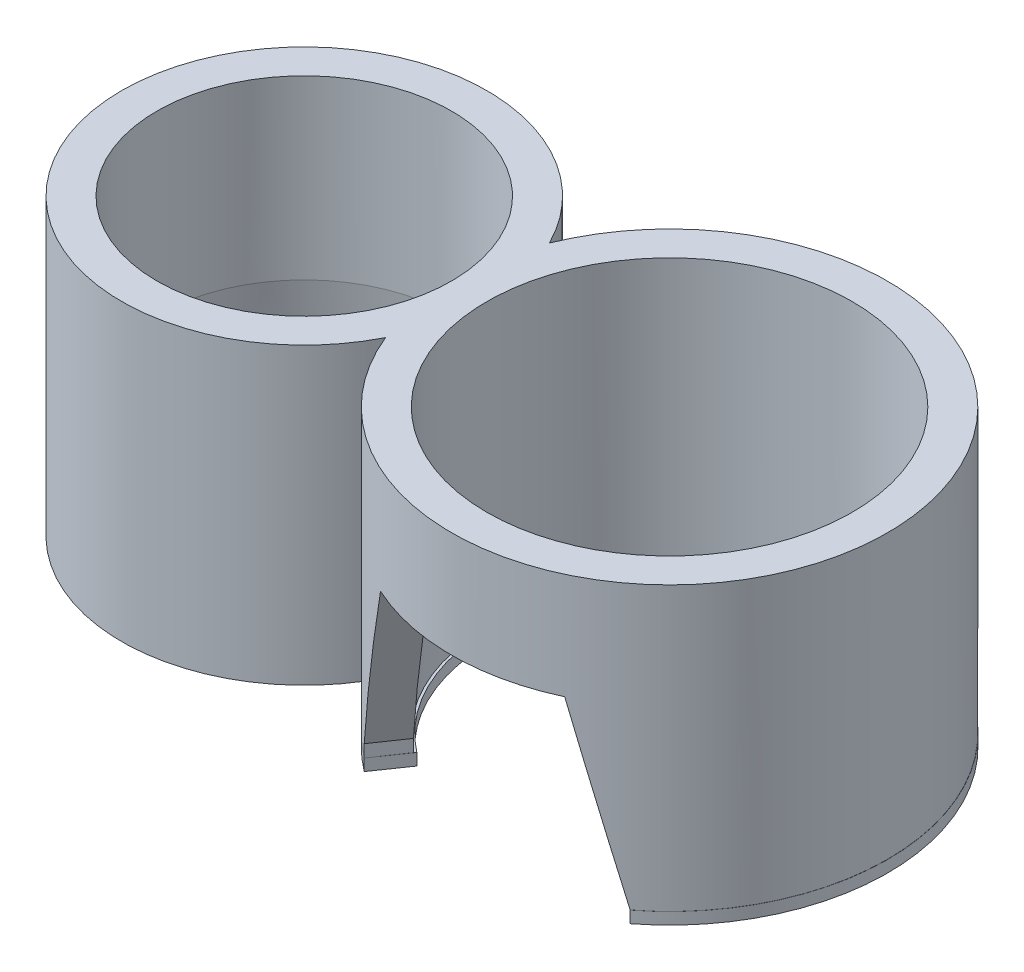
ISO-10303-21;
HEADER;
FILE_DESCRIPTION(('STEP AP214'),'2;1');
FILE_NAME('part.step','',(''),(''),'','','');
FILE_SCHEMA(('AUTOMOTIVE_DESIGN { 1 0 10303 214 1 1 1 1 }'));
ENDSEC;
DATA;
#1=APPLICATION_CONTEXT('core data for automotive mechanical design processes');
#2=APPLICATION_PROTOCOL_DEFINITION('international standard','automotive_design',2000,#1);
#3=PRODUCT_CONTEXT('',#1,'mechanical');
#4=PRODUCT('Part','Part','',(#3));
#5=PRODUCT_RELATED_PRODUCT_CATEGORY('part','',(#4));
#6=PRODUCT_DEFINITION_FORMATION('','',#4);
#7=PRODUCT_DEFINITION_CONTEXT('part definition',#1,'design');
#8=PRODUCT_DEFINITION('design','',#6,#7);
#9=PRODUCT_DEFINITION_SHAPE('','',#8);
#10=(LENGTH_UNIT() NAMED_UNIT(*) SI_UNIT(.MILLI.,.METRE.));
#11=(NAMED_UNIT(*) PLANE_ANGLE_UNIT() SI_UNIT($,.RADIAN.));
#12=(NAMED_UNIT(*) SI_UNIT($,.STERADIAN.) SOLID_ANGLE_UNIT());
#13=UNCERTAINTY_MEASURE_WITH_UNIT(LENGTH_MEASURE(1.E-05),#10,'distance_accuracy_value','');
#14=(GEOMETRIC_REPRESENTATION_CONTEXT(3) GLOBAL_UNCERTAINTY_ASSIGNED_CONTEXT((#13)) GLOBAL_UNIT_ASSIGNED_CONTEXT((#10,
#11,#12)) REPRESENTATION_CONTEXT('',''));
#15=CARTESIAN_POINT('',(0.,0.,0.));
#16=DIRECTION('',(0.,0.,1.));
#17=DIRECTION('',(1.,0.,0.));
#18=AXIS2_PLACEMENT_3D('',#15,#16,#17);
#19=CARTESIAN_POINT('',(31.,0.,0.));
#20=DIRECTION('',(0.,1.,0.));
#21=DIRECTION('',(0.,0.,1.));
#22=AXIS2_PLACEMENT_3D('',#19,#20,#21);
#23=PLANE('',#22);
#24=CARTESIAN_POINT('',(31.,0.,0.));
#25=DIRECTION('',(0.,1.,0.));
#26=DIRECTION('',(0.,0.,1.));
#27=AXIS2_PLACEMENT_3D('',#24,#25,#26);
#28=CIRCLE('',#27,18.5);
#29=CARTESIAN_POINT('',(19.8461192928033,0.,-14.759435801196));
#30=VERTEX_POINT('',#29);
#31=CARTESIAN_POINT('',(13.8548387096774,0.,-6.94934848232726));
#32=VERTEX_POINT('',#31);
#33=EDGE_CURVE('E267',#30,#32,#28,.T.);
#34=ORIENTED_EDGE('',*,*,#33,.F.);
#35=CARTESIAN_POINT('',(31.0079084105269,0.,0.));
#36=DIRECTION('',(0.,1.,0.));
#37=DIRECTION('',(0.,0.,-1.));
#38=AXIS2_PLACEMENT_3D('',#35,#36,#37);
#39=CIRCLE('',#38,18.5047691549546);
#40=CARTESIAN_POINT('',(13.856366755549,0.,-6.94630119817132));
#41=VERTEX_POINT('',#40);
#42=EDGE_CURVE('E216',#30,#41,#39,.T.);
#43=ORIENTED_EDGE('',*,*,#42,.T.);
#44=CARTESIAN_POINT('',(0.,0.,0.));
#45=DIRECTION('',(0.,1.,0.));
#46=DIRECTION('',(0.,0.,1.));
#47=AXIS2_PLACEMENT_3D('',#44,#45,#46);
#48=CIRCLE('',#47,15.5);
#49=EDGE_CURVE('E291',#32,#41,#48,.F.);
#50=ORIENTED_EDGE('',*,*,#49,.F.);
#51=EDGE_LOOP('',(#34,#43,#50));
#52=FACE_BOUND('',#51,.T.);
#53=ADVANCED_FACE('F37',(#52),#23,.F.);
#54=CARTESIAN_POINT('',(13.856366755549,0.,6.94630119817132));
#55=VERTEX_POINT('',#54);
#56=CARTESIAN_POINT('',(13.8548387096774,0.,6.94934848232726));
#57=VERTEX_POINT('',#56);
#58=EDGE_CURVE('E288',#55,#57,#48,.F.);
#59=ORIENTED_EDGE('',*,*,#58,.F.);
#60=CARTESIAN_POINT('',(19.8461192928095,0.,14.7594358012007));
#61=VERTEX_POINT('',#60);
#62=EDGE_CURVE('E212',#55,#61,#39,.T.);
#63=ORIENTED_EDGE('',*,*,#62,.T.);
#64=EDGE_CURVE('E277',#57,#61,#28,.T.);
#65=ORIENTED_EDGE('',*,*,#64,.F.);
#66=EDGE_LOOP('',(#59,#63,#65));
#67=FACE_BOUND('',#66,.T.);
#68=ADVANCED_FACE('F387',(#67),#23,.F.);
#69=CARTESIAN_POINT('',(31.,24.,0.));
#70=DIRECTION('',(0.,-1.,0.));
#71=DIRECTION('',(0.,0.,-1.));
#72=AXIS2_PLACEMENT_3D('',#69,#70,#71);
#73=CYLINDRICAL_SURFACE('',#72,18.5);
#74=DIRECTION('',(0.,-1.,0.));
#75=VECTOR('',#74,1.);
#76=CARTESIAN_POINT('',(19.8461192928095,15.,14.7594358012007));
#77=LINE('',#76,#75);
#78=CARTESIAN_POINT('',(19.8461192928095,1.0503422246361,14.7594358012007));
#79=VERTEX_POINT('',#78);
#80=EDGE_CURVE('E258',#79,#61,#77,.T.);
#81=ORIENTED_EDGE('',*,*,#80,.F.);
#82=CARTESIAN_POINT('',(31.,4.08789442123808,0.));
#83=DIRECTION('',(-0.793337471856332,0.275637355816994,-0.542807243712554));
#84=DIRECTION('',(-0.227485859404357,-0.96126169593832,-0.155647472491028));
#85=AXIS2_PLACEMENT_3D('',#82,#83,#84);
#86=ELLIPSE('',#85,67.1171726530523,18.5);
#87=CARTESIAN_POINT('',(23.2862741135748,15.,16.815125124396));
#88=VERTEX_POINT('',#87);
#89=EDGE_CURVE('E317',#79,#88,#86,.T.);
#90=ORIENTED_EDGE('',*,*,#89,.T.);
#91=CARTESIAN_POINT('',(31.,15.,0.));
#92=DIRECTION('',(0.,1.,0.));
#93=DIRECTION('',(0.,0.,1.));
#94=AXIS2_PLACEMENT_3D('',#91,#92,#93);
#95=CIRCLE('',#94,18.5);
#96=CARTESIAN_POINT('',(38.8519848958177,15.,16.7510099156992));
#97=VERTEX_POINT('',#96);
#98=EDGE_CURVE('E234',#88,#97,#95,.T.);
#99=ORIENTED_EDGE('',*,*,#98,.T.);
#100=CARTESIAN_POINT('',(31.,0.0717967697242,0.));
#101=DIRECTION('',(-0.765276758709765,-0.258819045102516,0.589376097641309));
#102=DIRECTION('',(0.205055289482585,-0.96592582628907,-0.157922849401192));
#103=AXIS2_PLACEMENT_3D('',#100,#101,#102);
#104=ELLIPSE('',#103,71.4785111453924,18.5);
#105=CARTESIAN_POINT('',(42.2880901510352,0.071796769724207,14.6570467947026));
#106=VERTEX_POINT('',#105);
#107=EDGE_CURVE('E330',#97,#106,#104,.F.);
#108=ORIENTED_EDGE('',*,*,#107,.T.);
#109=DIRECTION('',(0.,-1.,0.));
#110=VECTOR('',#109,1.);
#111=CARTESIAN_POINT('',(42.2880901510352,15.,14.6570467947026));
#112=LINE('',#111,#110);
#113=CARTESIAN_POINT('',(42.2880901510352,0.,14.6570467947026));
#114=VERTEX_POINT('',#113);
#115=EDGE_CURVE('E255',#106,#114,#112,.T.);
#116=ORIENTED_EDGE('',*,*,#115,.T.);
#117=CARTESIAN_POINT('',(42.2881552180154,0.,14.6569966832906));
#118=VERTEX_POINT('',#117);
#119=EDGE_CURVE('E280',#114,#118,#28,.T.);
#120=ORIENTED_EDGE('',*,*,#119,.T.);
#121=CARTESIAN_POINT('',(31.,0.,0.));
#122=DIRECTION('',(0.,-1.,0.));
#123=DIRECTION('',(0.,0.,-1.));
#124=AXIS2_PLACEMENT_3D('',#121,#122,#123);
#125=CIRCLE('',#124,18.5);
#126=EDGE_CURVE('E220',#30,#118,#125,.T.);
#127=ORIENTED_EDGE('',*,*,#126,.F.);
#128=ORIENTED_EDGE('',*,*,#33,.T.);
#129=DIRECTION('',(0.,-1.,0.));
#130=VECTOR('',#129,1.);
#131=CARTESIAN_POINT('',(13.8548387096774,12.,-6.94934848232726));
#132=LINE('',#131,#130);
#133=CARTESIAN_POINT('',(13.8548387096774,24.,-6.94934848232726));
#134=VERTEX_POINT('',#133);
#135=EDGE_CURVE('E284',#134,#32,#132,.T.);
#136=ORIENTED_EDGE('',*,*,#135,.F.);
#137=CARTESIAN_POINT('',(31.,24.,0.));
#138=DIRECTION('',(0.,1.,0.));
#139=DIRECTION('',(0.,0.,1.));
#140=AXIS2_PLACEMENT_3D('',#137,#138,#139);
#141=CIRCLE('',#140,18.5);
#142=CARTESIAN_POINT('',(13.8548387096774,24.,6.94934848232726));
#143=VERTEX_POINT('',#142);
#144=EDGE_CURVE('E272',#143,#134,#141,.T.);
#145=ORIENTED_EDGE('',*,*,#144,.F.);
#146=DIRECTION('',(0.,-1.,0.));
#147=VECTOR('',#146,1.);
#148=CARTESIAN_POINT('',(13.8548387096774,12.,6.94934848232726));
#149=LINE('',#148,#147);
#150=EDGE_CURVE('E276',#57,#143,#149,.F.);
#151=ORIENTED_EDGE('',*,*,#150,.F.);
#152=ORIENTED_EDGE('',*,*,#64,.T.);
#153=EDGE_LOOP('',(#81,#90,#99,#108,#116,#120,#127,#128,#136,#145,#151,#152));
#154=FACE_BOUND('',#153,.T.);
#155=ADVANCED_FACE('F381',(#154),#73,.T.);
#156=CARTESIAN_POINT('',(31.,24.,0.));
#157=DIRECTION('',(0.,-1.,0.));
#158=DIRECTION('',(0.,0.,-1.));
#159=AXIS2_PLACEMENT_3D('',#156,#157,#158);
#160=CYLINDRICAL_SURFACE('',#159,15.5);
#161=CARTESIAN_POINT('',(31.,24.,0.));
#162=DIRECTION('',(0.,1.,0.));
#163=DIRECTION('',(0.,0.,1.));
#164=AXIS2_PLACEMENT_3D('',#161,#162,#163);
#165=CIRCLE('',#164,15.5);
#166=CARTESIAN_POINT('',(31.,24.,15.5));
#167=VERTEX_POINT('',#166);
#168=EDGE_CURVE('E263',#167,#167,#165,.T.);
#169=ORIENTED_EDGE('',*,*,#168,.T.);
#170=EDGE_LOOP('',(#169));
#171=FACE_BOUND('',#170,.T.);
#172=CARTESIAN_POINT('',(31.,15.,0.));
#173=DIRECTION('',(0.,1.,0.));
#174=DIRECTION('',(0.,0.,1.));
#175=AXIS2_PLACEMENT_3D('',#172,#173,#174);
#176=CIRCLE('',#175,15.5);
#177=CARTESIAN_POINT('',(25.0100113100996,15.,14.2958048215155));
#178=VERTEX_POINT('',#177);
#179=CARTESIAN_POINT('',(36.9681474200882,15.,14.3049367832261));
#180=VERTEX_POINT('',#179);
#181=EDGE_CURVE('E238',#178,#180,#176,.T.);
#182=ORIENTED_EDGE('',*,*,#181,.F.);
#183=CARTESIAN_POINT('',(31.,4.08789442123808,0.));
#184=DIRECTION('',(-0.793337471856332,0.275637355816994,-0.542807243712554));
#185=DIRECTION('',(-0.227485859404357,-0.96126169593832,-0.155647472491028));
#186=AXIS2_PLACEMENT_3D('',#183,#184,#185);
#187=ELLIPSE('',#186,56.2333068174222,15.5);
#188=CARTESIAN_POINT('',(21.5424109545381,1.0503422246361,12.2802283955616));
#189=VERTEX_POINT('',#188);
#190=EDGE_CURVE('E320',#178,#189,#187,.F.);
#191=ORIENTED_EDGE('',*,*,#190,.T.);
#192=DIRECTION('',(0.,-1.,0.));
#193=VECTOR('',#192,1.);
#194=CARTESIAN_POINT('',(21.5424109545381,15.,12.2802283955616));
#195=LINE('',#194,#193);
#196=CARTESIAN_POINT('',(21.5424109545381,0.,12.2802283955616));
#197=VERTEX_POINT('',#196);
#198=EDGE_CURVE('E243',#189,#197,#195,.T.);
#199=ORIENTED_EDGE('',*,*,#198,.T.);
#200=CARTESIAN_POINT('',(31.,0.,0.));
#201=DIRECTION('',(0.,1.,0.));
#202=DIRECTION('',(0.,0.,1.));
#203=AXIS2_PLACEMENT_3D('',#200,#201,#202);
#204=CIRCLE('',#203,15.5);
#205=CARTESIAN_POINT('',(40.4779883380714,0.,12.2644909011088));
#206=VERTEX_POINT('',#205);
#207=EDGE_CURVE('E268',#206,#197,#204,.T.);
#208=ORIENTED_EDGE('',*,*,#207,.F.);
#209=CARTESIAN_POINT('',(40.457589045462,0.,12.2802283955616));
#210=VERTEX_POINT('',#209);
#211=EDGE_CURVE('E262',#210,#206,#204,.T.);
#212=ORIENTED_EDGE('',*,*,#211,.F.);
#213=DIRECTION('',(0.,-1.,0.));
#214=VECTOR('',#213,1.);
#215=CARTESIAN_POINT('',(40.457589045462,15.,12.2802283955616));
#216=LINE('',#215,#214);
#217=CARTESIAN_POINT('',(40.457589045462,0.071796769724207,12.2802283955616));
#218=VERTEX_POINT('',#217);
#219=EDGE_CURVE('E252',#218,#210,#216,.T.);
#220=ORIENTED_EDGE('',*,*,#219,.F.);
#221=CARTESIAN_POINT('',(31.,0.0717967697242,0.));
#222=DIRECTION('',(-0.765276758709765,-0.258819045102516,0.589376097641309));
#223=DIRECTION('',(0.205055289482585,-0.96592582628907,-0.157922849401192));
#224=AXIS2_PLACEMENT_3D('',#221,#222,#223);
#225=ELLIPSE('',#224,59.8874012299233,15.5);
#226=EDGE_CURVE('E333',#218,#180,#225,.T.);
#227=ORIENTED_EDGE('',*,*,#226,.T.);
#228=EDGE_LOOP('',(#182,#191,#199,#208,#212,#220,#227));
#229=FACE_BOUND('',#228,.T.);
#230=ADVANCED_FACE('F377',(#171,#229),#160,.F.);
#231=CARTESIAN_POINT('',(0.,-1.,0.));
#232=DIRECTION('',(0.,1.,0.));
#233=DIRECTION('',(0.,0.,1.));
#234=AXIS2_PLACEMENT_3D('',#231,#232,#233);
#235=CYLINDRICAL_SURFACE('',#234,15.5);
#236=DIRECTION('',(0.,1.,0.));
#237=VECTOR('',#236,1.);
#238=CARTESIAN_POINT('',(13.856366755549,-0.5,-6.94630119817132));
#239=LINE('',#238,#237);
#240=CARTESIAN_POINT('',(13.856366755549,-1.,-6.94630119817132));
#241=VERTEX_POINT('',#240);
#242=EDGE_CURVE('E64',#241,#41,#239,.T.);
#243=ORIENTED_EDGE('',*,*,#242,.F.);
#244=CARTESIAN_POINT('',(0.,-1.,0.));
#245=DIRECTION('',(0.,1.,0.));
#246=DIRECTION('',(0.,0.,1.));
#247=AXIS2_PLACEMENT_3D('',#244,#245,#246);
#248=CIRCLE('',#247,15.5);
#249=CARTESIAN_POINT('',(13.856366755549,-1.,6.94630119817132));
#250=VERTEX_POINT('',#249);
#251=EDGE_CURVE('E300',#241,#250,#248,.T.);
#252=ORIENTED_EDGE('',*,*,#251,.T.);
#253=DIRECTION('',(0.,1.,0.));
#254=VECTOR('',#253,1.);
#255=CARTESIAN_POINT('',(13.856366755549,-0.5,6.94630119817132));
#256=LINE('',#255,#254);
#257=EDGE_CURVE('E58',#55,#250,#256,.F.);
#258=ORIENTED_EDGE('',*,*,#257,.F.);
#259=ORIENTED_EDGE('',*,*,#58,.T.);
#260=ORIENTED_EDGE('',*,*,#150,.T.);
#261=CARTESIAN_POINT('',(0.,24.,0.));
#262=DIRECTION('',(0.,1.,0.));
#263=DIRECTION('',(0.,0.,1.));
#264=AXIS2_PLACEMENT_3D('',#261,#262,#263);
#265=CIRCLE('',#264,15.5);
#266=EDGE_CURVE('E296',#134,#143,#265,.T.);
#267=ORIENTED_EDGE('',*,*,#266,.F.);
#268=ORIENTED_EDGE('',*,*,#135,.T.);
#269=ORIENTED_EDGE('',*,*,#49,.T.);
#270=EDGE_LOOP('',(#243,#252,#258,#259,#260,#267,#268,#269));
#271=FACE_BOUND('',#270,.T.);
#272=ADVANCED_FACE('F380',(#271),#235,.T.);
#273=CARTESIAN_POINT('',(0.,-1.,0.));
#274=DIRECTION('',(0.,1.,0.));
#275=DIRECTION('',(0.,0.,1.));
#276=AXIS2_PLACEMENT_3D('',#273,#274,#275);
#277=PLANE('',#276);
#278=CARTESIAN_POINT('',(31.0079084105269,-1.,0.));
#279=DIRECTION('',(0.,1.,0.));
#280=DIRECTION('',(0.,0.,-1.));
#281=AXIS2_PLACEMENT_3D('',#278,#279,#280);
#282=CIRCLE('',#281,18.5047691549546);
#283=CARTESIAN_POINT('',(12.8669029277803,-1.,-3.65108224409073));
#284=VERTEX_POINT('',#283);
#285=CARTESIAN_POINT('',(12.8669029277803,-1.,3.65108224409073));
#286=VERTEX_POINT('',#285);
#287=EDGE_CURVE('E203',#284,#286,#282,.T.);
#288=ORIENTED_EDGE('',*,*,#287,.F.);
#289=CARTESIAN_POINT('',(0.,-1.,0.));
#290=DIRECTION('',(0.,1.,0.));
#291=DIRECTION('',(0.,0.,1.));
#292=AXIS2_PLACEMENT_3D('',#289,#290,#291);
#293=CIRCLE('',#292,13.3748866352592);
#294=EDGE_CURVE('E303',#284,#286,#293,.T.);
#295=ORIENTED_EDGE('',*,*,#294,.T.);
#296=EDGE_LOOP('',(#288,#295));
#297=FACE_BOUND('',#296,.T.);
#298=ORIENTED_EDGE('',*,*,#251,.F.);
#299=CARTESIAN_POINT('',(42.2939438163146,-1.,14.664647499939));
#300=VERTEX_POINT('',#299);
#301=EDGE_CURVE('E185',#300,#241,#282,.T.);
#302=ORIENTED_EDGE('',*,*,#301,.F.);
#303=DIRECTION('',(0.603362544977963,0.,0.79746701456406));
#304=VECTOR('',#303,1.);
#305=CARTESIAN_POINT('',(40.3602270942083,-1.,12.1088453305368));
#306=LINE('',#305,#304);
#307=CARTESIAN_POINT('',(40.3602270942083,-1.,12.1088453305368));
#308=VERTEX_POINT('',#307);
#309=EDGE_CURVE('E165',#308,#300,#306,.T.);
#310=ORIENTED_EDGE('',*,*,#309,.F.);
#311=CARTESIAN_POINT('',(31.0079084105269,-1.,0.));
#312=DIRECTION('',(0.,-1.,0.));
#313=DIRECTION('',(0.,0.,-1.));
#314=AXIS2_PLACEMENT_3D('',#311,#312,#313);
#315=CIRCLE('',#314,15.3);
#316=CARTESIAN_POINT('',(21.667455033248,-1.,12.1180002767321));
#317=VERTEX_POINT('',#316);
#318=EDGE_CURVE('E182',#317,#308,#315,.T.);
#319=ORIENTED_EDGE('',*,*,#318,.F.);
#320=DIRECTION('',(0.56766031041681,0.,-0.823262881452511));
#321=VECTOR('',#320,1.);
#322=CARTESIAN_POINT('',(21.667455033248,-1.,12.1180002767321));
#323=LINE('',#322,#321);
#324=CARTESIAN_POINT('',(19.8461192928095,-1.,14.7594358012007));
#325=VERTEX_POINT('',#324);
#326=EDGE_CURVE('E175',#325,#317,#323,.T.);
#327=ORIENTED_EDGE('',*,*,#326,.F.);
#328=EDGE_CURVE('E187',#250,#325,#282,.T.);
#329=ORIENTED_EDGE('',*,*,#328,.F.);
#330=EDGE_LOOP('',(#298,#302,#310,#319,#327,#329));
#331=FACE_BOUND('',#330,.T.);
#332=ADVANCED_FACE('F180',(#297,#331),#277,.F.);
#333=CARTESIAN_POINT('',(0.,-1.,0.));
#334=DIRECTION('',(0.,1.,0.));
#335=DIRECTION('',(0.,0.,1.));
#336=AXIS2_PLACEMENT_3D('',#333,#334,#335);
#337=CYLINDRICAL_SURFACE('',#336,12.5);
#338=CARTESIAN_POINT('',(0.,8.99999999999987,0.));
#339=DIRECTION('',(0.,1.,0.));
#340=DIRECTION('',(0.,0.,1.));
#341=AXIS2_PLACEMENT_3D('',#338,#339,#340);
#342=CIRCLE('',#341,12.5);
#343=CARTESIAN_POINT('',(0.,8.99999999999987,12.5));
#344=VERTEX_POINT('',#343);
#345=EDGE_CURVE('E307',#344,#344,#342,.F.);
#346=ORIENTED_EDGE('',*,*,#345,.T.);
#347=EDGE_LOOP('',(#346));
#348=FACE_BOUND('',#347,.T.);
#349=CARTESIAN_POINT('',(0.,24.,0.));
#350=DIRECTION('',(0.,1.,0.));
#351=DIRECTION('',(0.,0.,1.));
#352=AXIS2_PLACEMENT_3D('',#349,#350,#351);
#353=CIRCLE('',#352,12.5);
#354=CARTESIAN_POINT('',(0.,24.,12.5));
#355=VERTEX_POINT('',#354);
#356=EDGE_CURVE('E292',#355,#355,#353,.T.);
#357=ORIENTED_EDGE('',*,*,#356,.T.);
#358=EDGE_LOOP('',(#357));
#359=FACE_BOUND('',#358,.T.);
#360=ADVANCED_FACE('F393',(#348,#359),#337,.F.);
#361=CARTESIAN_POINT('',(0.,24.,0.));
#362=DIRECTION('',(0.,1.,0.));
#363=DIRECTION('',(0.,0.,1.));
#364=AXIS2_PLACEMENT_3D('',#361,#362,#363);
#365=PLANE('',#364);
#366=ORIENTED_EDGE('',*,*,#144,.T.);
#367=ORIENTED_EDGE('',*,*,#266,.T.);
#368=EDGE_LOOP('',(#366,#367));
#369=FACE_BOUND('',#368,.T.);
#370=ORIENTED_EDGE('',*,*,#356,.F.);
#371=EDGE_LOOP('',(#370));
#372=FACE_BOUND('',#371,.T.);
#373=ORIENTED_EDGE('',*,*,#168,.F.);
#374=EDGE_LOOP('',(#373));
#375=FACE_BOUND('',#374,.T.);
#376=ADVANCED_FACE('F385',(#369,#372,#375),#365,.T.);
#377=ORIENTED_EDGE('',*,*,#211,.T.);
#378=DIRECTION('',(0.603362544977963,0.,0.79746701456406));
#379=VECTOR('',#378,1.);
#380=CARTESIAN_POINT('',(40.3602270942083,0.,12.1088453305368));
#381=LINE('',#380,#379);
#382=EDGE_CURVE('E213',#206,#118,#381,.T.);
#383=ORIENTED_EDGE('',*,*,#382,.T.);
#384=ORIENTED_EDGE('',*,*,#119,.F.);
#385=DIRECTION('',(0.610167035191094,0.,0.792272799713653));
#386=VECTOR('',#385,1.);
#387=CARTESIAN_POINT('',(19.4585818641494,0.,-14.9859811031786));
#388=LINE('',#387,#386);
#389=EDGE_CURVE('E239',#210,#114,#388,.T.);
#390=ORIENTED_EDGE('',*,*,#389,.F.);
#391=EDGE_LOOP('',(#377,#383,#384,#390));
#392=FACE_BOUND('',#391,.T.);
#393=ADVANCED_FACE('F375',(#392),#23,.F.);
#394=CARTESIAN_POINT('',(20.3963118858517,15.,13.9553043054365));
#395=DIRECTION('',(0.82530852442001,0.,0.56468206941576));
#396=DIRECTION('',(0.56468206941576,0.,-0.82530852442001));
#397=AXIS2_PLACEMENT_3D('',#394,#395,#396);
#398=PLANE('',#397);
#399=ORIENTED_EDGE('',*,*,#198,.F.);
#400=DIRECTION('',(-0.56468206941576,0.,0.82530852442001));
#401=VECTOR('',#400,1.);
#402=CARTESIAN_POINT('',(20.3963118858517,1.0503422246361,13.9553043054365));
#403=LINE('',#402,#401);
#404=EDGE_CURVE('E311',#189,#79,#403,.T.);
#405=ORIENTED_EDGE('',*,*,#404,.T.);
#406=ORIENTED_EDGE('',*,*,#80,.T.);
#407=DIRECTION('',(-0.56468206941576,0.,0.82530852442001));
#408=VECTOR('',#407,1.);
#409=CARTESIAN_POINT('',(20.3963118858517,0.,13.9553043054365));
#410=LINE('',#409,#408);
#411=EDGE_CURVE('E233',#197,#61,#410,.T.);
#412=ORIENTED_EDGE('',*,*,#411,.F.);
#413=EDGE_LOOP('',(#399,#405,#406,#412));
#414=FACE_BOUND('',#413,.T.);
#415=ADVANCED_FACE('F371',(#414),#398,.T.);
#416=CARTESIAN_POINT('',(19.4585818641494,15.,-14.9859811031786));
#417=DIRECTION('',(0.792272799713653,0.,-0.610167035191094));
#418=DIRECTION('',(-0.610167035191094,0.,-0.792272799713653));
#419=AXIS2_PLACEMENT_3D('',#416,#417,#418);
#420=PLANE('',#419);
#421=ORIENTED_EDGE('',*,*,#115,.F.);
#422=DIRECTION('',(-0.610167035191094,0.,-0.792272799713653));
#423=VECTOR('',#422,1.);
#424=CARTESIAN_POINT('',(40.457589045462,0.0717967697242072,12.2802283955616));
#425=LINE('',#424,#423);
#426=EDGE_CURVE('E327',#106,#218,#425,.T.);
#427=ORIENTED_EDGE('',*,*,#426,.T.);
#428=ORIENTED_EDGE('',*,*,#219,.T.);
#429=ORIENTED_EDGE('',*,*,#389,.T.);
#430=EDGE_LOOP('',(#421,#427,#428,#429));
#431=FACE_BOUND('',#430,.T.);
#432=ADVANCED_FACE('F367',(#431),#420,.F.);
#433=CARTESIAN_POINT('',(0.,15.,0.));
#434=DIRECTION('',(0.,1.,0.));
#435=DIRECTION('',(0.,0.,1.));
#436=AXIS2_PLACEMENT_3D('',#433,#434,#435);
#437=PLANE('',#436);
#438=ORIENTED_EDGE('',*,*,#181,.T.);
#439=DIRECTION('',(0.610167035191094,0.,0.792272799713653));
#440=VECTOR('',#439,1.);
#441=CARTESIAN_POINT('',(39.1189989521806,15.,17.097714935467));
#442=LINE('',#441,#440);
#443=EDGE_CURVE('E323',#180,#97,#442,.T.);
#444=ORIENTED_EDGE('',*,*,#443,.T.);
#445=ORIENTED_EDGE('',*,*,#98,.F.);
#446=DIRECTION('',(0.56468206941576,0.,-0.82530852442001));
#447=VECTOR('',#446,1.);
#448=CARTESIAN_POINT('',(23.6975459835318,15.,16.2140325830996));
#449=LINE('',#448,#447);
#450=EDGE_CURVE('E315',#88,#178,#449,.T.);
#451=ORIENTED_EDGE('',*,*,#450,.T.);
#452=EDGE_LOOP('',(#438,#444,#445,#451));
#453=FACE_BOUND('',#452,.T.);
#454=ADVANCED_FACE('F364',(#453),#437,.F.);
#455=CARTESIAN_POINT('',(0.,-1.,0.));
#456=DIRECTION('',(0.,-1.,0.));
#457=DIRECTION('',(0.,0.,-1.));
#458=AXIS2_PLACEMENT_3D('',#455,#456,#457);
#459=CONICAL_SURFACE('',#458,13.3748866352592,0.0872664625997131);
#460=CARTESIAN_POINT('',(12.8292816762225,0.000199999999941291,-3.45890322689037));
#461=CARTESIAN_POINT('',(12.8355270572717,-0.166387156543844,-3.4917052119742));
#462=CARTESIAN_POINT('',(12.8417854810747,-0.333047402241522,-3.52412424780057));
#463=CARTESIAN_POINT('',(12.8543284140746,-0.666514068910767,-3.58819642035543));
#464=CARTESIAN_POINT('',(12.860612923271,-0.833320489879673,-3.61984955709787));
#465=CARTESIAN_POINT('',(12.8669104752208,-1.00019999999981,-3.65111974459678));
#466=B_SPLINE_CURVE_WITH_KNOTS('',3,(#460,#461,#462,#463,#464,#465),.UNSPECIFIED.,.F.,.F.,(4,2,
4),(0.,0.509698139329334,1.01939626938415),.UNSPECIFIED.);
#467=CARTESIAN_POINT('',(12.8292891742834,0.,-3.45894263349888));
#468=VERTEX_POINT('',#467);
#469=EDGE_CURVE('E11',#468,#284,#466,.T.);
#470=ORIENTED_EDGE('',*,*,#469,.F.);
#471=CARTESIAN_POINT('',(0.,0.,0.));
#472=DIRECTION('',(0.,-1.,0.));
#473=DIRECTION('',(0.,0.,-1.));
#474=AXIS2_PLACEMENT_3D('',#471,#472,#473);
#475=CIRCLE('',#474,13.2873979717333);
#476=CARTESIAN_POINT('',(12.8292891742834,0.,3.45894263349888));
#477=VERTEX_POINT('',#476);
#478=EDGE_CURVE('E336',#468,#477,#475,.T.);
#479=ORIENTED_EDGE('',*,*,#478,.T.);
#480=CARTESIAN_POINT('',(12.8669104752208,-1.0002,3.65111974459583));
#481=CARTESIAN_POINT('',(12.860612923271,-0.833320489879799,3.61984955709724));
#482=CARTESIAN_POINT('',(12.8543284140746,-0.666514068910832,3.58819642035512));
#483=CARTESIAN_POINT('',(12.8417854810747,-0.333047402241467,3.52412424780089));
#484=CARTESIAN_POINT('',(12.8355270572717,-0.166387156543729,3.49170521197483));
#485=CARTESIAN_POINT('',(12.8292816762225,0.00020000000011577,3.4589032268913));
#486=B_SPLINE_CURVE_WITH_KNOTS('',3,(#480,#481,#482,#483,#484,#485),.UNSPECIFIED.,.F.,.F.,(4,2,
4),(0.,0.509698130054816,1.01939626938415),.UNSPECIFIED.);
#487=EDGE_CURVE('E51',#286,#477,#486,.T.);
#488=ORIENTED_EDGE('',*,*,#487,.F.);
#489=ORIENTED_EDGE('',*,*,#294,.F.);
#490=EDGE_LOOP('',(#470,#479,#488,#489));
#491=FACE_BOUND('',#490,.T.);
#492=ORIENTED_EDGE('',*,*,#345,.F.);
#493=EDGE_LOOP('',(#492));
#494=FACE_BOUND('',#493,.T.);
#495=ADVANCED_FACE('F344',(#491,#494),#459,.F.);
#496=CARTESIAN_POINT('',(20.3963118858517,1.0503422246361,13.9553043054365));
#497=DIRECTION('',(-0.793337471856332,0.275637355816994,-0.542807243712554));
#498=DIRECTION('',(-0.56468206941576,0.,0.82530852442001));
#499=AXIS2_PLACEMENT_3D('',#496,#497,#498);
#500=PLANE('',#499);
#501=ORIENTED_EDGE('',*,*,#190,.F.);
#502=ORIENTED_EDGE('',*,*,#450,.F.);
#503=ORIENTED_EDGE('',*,*,#89,.F.);
#504=ORIENTED_EDGE('',*,*,#404,.F.);
#505=EDGE_LOOP('',(#501,#502,#503,#504));
#506=FACE_BOUND('',#505,.T.);
#507=ADVANCED_FACE('F471',(#506),#500,.F.);
#508=CARTESIAN_POINT('',(16.2894906652948,15.,-12.5453129624143));
#509=DIRECTION('',(-0.765276758709765,-0.258819045102516,0.589376097641309));
#510=DIRECTION('',(-0.610167035191094,0.,-0.792272799713653));
#511=AXIS2_PLACEMENT_3D('',#508,#509,#510);
#512=PLANE('',#511);
#513=ORIENTED_EDGE('',*,*,#226,.F.);
#514=ORIENTED_EDGE('',*,*,#426,.F.);
#515=ORIENTED_EDGE('',*,*,#107,.F.);
#516=ORIENTED_EDGE('',*,*,#443,.F.);
#517=EDGE_LOOP('',(#513,#514,#515,#516));
#518=FACE_BOUND('',#517,.T.);
#519=ADVANCED_FACE('F39',(#518),#512,.T.);
#520=CARTESIAN_POINT('',(31.0079084105269,0.,0.));
#521=DIRECTION('',(0.,-1.,0.));
#522=DIRECTION('',(0.,0.,-1.));
#523=AXIS2_PLACEMENT_3D('',#520,#521,#522);
#524=PLANE('',#523);
#525=ORIENTED_EDGE('',*,*,#478,.F.);
#526=EDGE_CURVE('E421',#468,#477,#39,.T.);
#527=ORIENTED_EDGE('',*,*,#526,.T.);
#528=EDGE_LOOP('',(#525,#527));
#529=FACE_BOUND('',#528,.T.);
#530=ADVANCED_FACE('F353',(#529),#524,.F.);
#531=CARTESIAN_POINT('',(31.0079084105269,-1.,0.));
#532=DIRECTION('',(0.,1.,0.));
#533=DIRECTION('',(0.,0.,1.));
#534=AXIS2_PLACEMENT_3D('',#531,#532,#533);
#535=CYLINDRICAL_SURFACE('',#534,18.5047691549546);
#536=ORIENTED_EDGE('',*,*,#526,.F.);
#537=ORIENTED_EDGE('',*,*,#469,.T.);
#538=ORIENTED_EDGE('',*,*,#287,.T.);
#539=ORIENTED_EDGE('',*,*,#487,.T.);
#540=EDGE_LOOP('',(#536,#537,#538,#539));
#541=FACE_BOUND('',#540,.T.);
#542=ADVANCED_FACE('F347',(#541),#535,.T.);
#543=ORIENTED_EDGE('',*,*,#301,.T.);
#544=ORIENTED_EDGE('',*,*,#242,.T.);
#545=ORIENTED_EDGE('',*,*,#42,.F.);
#546=CARTESIAN_POINT('',(42.2939438163146,0.,14.664647499939));
#547=VERTEX_POINT('',#546);
#548=EDGE_CURVE('E198',#547,#30,#39,.T.);
#549=ORIENTED_EDGE('',*,*,#548,.F.);
#550=DIRECTION('',(0.,1.,0.));
#551=VECTOR('',#550,1.);
#552=CARTESIAN_POINT('',(42.2939438163146,-1.,14.664647499939));
#553=LINE('',#552,#551);
#554=EDGE_CURVE('E174',#300,#547,#553,.T.);
#555=ORIENTED_EDGE('',*,*,#554,.F.);
#556=EDGE_LOOP('',(#543,#544,#545,#549,#555));
#557=FACE_BOUND('',#556,.T.);
#558=ADVANCED_FACE('F352',(#557),#535,.T.);
#559=ORIENTED_EDGE('',*,*,#62,.F.);
#560=ORIENTED_EDGE('',*,*,#257,.T.);
#561=ORIENTED_EDGE('',*,*,#328,.T.);
#562=DIRECTION('',(0.,1.,0.));
#563=VECTOR('',#562,1.);
#564=CARTESIAN_POINT('',(19.8461192928095,-1.,14.7594358012007));
#565=LINE('',#564,#563);
#566=EDGE_CURVE('E221',#325,#61,#565,.T.);
#567=ORIENTED_EDGE('',*,*,#566,.T.);
#568=EDGE_LOOP('',(#559,#560,#561,#567));
#569=FACE_BOUND('',#568,.T.);
#570=ADVANCED_FACE('F355',(#569),#535,.T.);
#571=CARTESIAN_POINT('',(40.3602270942083,0.,12.1088453305368));
#572=VERTEX_POINT('',#571);
#573=EDGE_CURVE('E168',#572,#206,#381,.T.);
#574=ORIENTED_EDGE('',*,*,#573,.T.);
#575=ORIENTED_EDGE('',*,*,#207,.T.);
#576=ORIENTED_EDGE('',*,*,#411,.T.);
#577=DIRECTION('',(0.56766031041681,0.,-0.823262881452511));
#578=VECTOR('',#577,1.);
#579=CARTESIAN_POINT('',(21.667455033248,0.,12.1180002767321));
#580=LINE('',#579,#578);
#581=CARTESIAN_POINT('',(21.667455033248,0.,12.1180002767321));
#582=VERTEX_POINT('',#581);
#583=EDGE_CURVE('E192',#61,#582,#580,.T.);
#584=ORIENTED_EDGE('',*,*,#583,.T.);
#585=CARTESIAN_POINT('',(31.0079084105269,0.,0.));
#586=DIRECTION('',(0.,-1.,0.));
#587=DIRECTION('',(0.,0.,-1.));
#588=AXIS2_PLACEMENT_3D('',#585,#586,#587);
#589=CIRCLE('',#588,15.3);
#590=EDGE_CURVE('E206',#582,#572,#589,.T.);
#591=ORIENTED_EDGE('',*,*,#590,.T.);
#592=EDGE_LOOP('',(#574,#575,#576,#584,#591));
#593=FACE_BOUND('',#592,.T.);
#594=ADVANCED_FACE('F428',(#593),#524,.F.);
#595=ORIENTED_EDGE('',*,*,#548,.T.);
#596=ORIENTED_EDGE('',*,*,#126,.T.);
#597=EDGE_CURVE('E209',#118,#547,#381,.T.);
#598=ORIENTED_EDGE('',*,*,#597,.T.);
#599=EDGE_LOOP('',(#595,#596,#598));
#600=FACE_BOUND('',#599,.T.);
#601=ADVANCED_FACE('F363',(#600),#524,.F.);
#602=CARTESIAN_POINT('',(31.0079084105269,-1.,0.));
#603=DIRECTION('',(0.,1.,0.));
#604=DIRECTION('',(0.,0.,1.));
#605=AXIS2_PLACEMENT_3D('',#602,#603,#604);
#606=CYLINDRICAL_SURFACE('',#605,15.3);
#607=ORIENTED_EDGE('',*,*,#590,.F.);
#608=DIRECTION('',(0.,1.,0.));
#609=VECTOR('',#608,1.);
#610=CARTESIAN_POINT('',(21.667455033248,-1.,12.1180002767321));
#611=LINE('',#610,#609);
#612=EDGE_CURVE('E190',#317,#582,#611,.T.);
#613=ORIENTED_EDGE('',*,*,#612,.F.);
#614=ORIENTED_EDGE('',*,*,#318,.T.);
#615=DIRECTION('',(0.,1.,0.));
#616=VECTOR('',#615,1.);
#617=CARTESIAN_POINT('',(40.3602270942083,-1.,12.1088453305368));
#618=LINE('',#617,#616);
#619=EDGE_CURVE('E161',#308,#572,#618,.T.);
#620=ORIENTED_EDGE('',*,*,#619,.T.);
#621=EDGE_LOOP('',(#607,#613,#614,#620));
#622=FACE_BOUND('',#621,.T.);
#623=ADVANCED_FACE('F189',(#622),#606,.F.);
#624=CARTESIAN_POINT('',(21.667455033248,-1.,12.1180002767321));
#625=DIRECTION('',(0.823262881452511,0.,0.56766031041681));
#626=DIRECTION('',(0.56766031041681,0.,-0.823262881452511));
#627=AXIS2_PLACEMENT_3D('',#624,#625,#626);
#628=PLANE('',#627);
#629=ORIENTED_EDGE('',*,*,#583,.F.);
#630=ORIENTED_EDGE('',*,*,#566,.F.);
#631=ORIENTED_EDGE('',*,*,#326,.T.);
#632=ORIENTED_EDGE('',*,*,#612,.T.);
#633=EDGE_LOOP('',(#629,#630,#631,#632));
#634=FACE_BOUND('',#633,.T.);
#635=ADVANCED_FACE('F356',(#634),#628,.T.);
#636=CARTESIAN_POINT('',(40.3602270942083,-1.,12.1088453305368));
#637=DIRECTION('',(-0.79746701456406,0.,0.603362544977964));
#638=DIRECTION('',(0.603362544977964,0.,0.79746701456406));
#639=AXIS2_PLACEMENT_3D('',#636,#637,#638);
#640=PLANE('',#639);
#641=ORIENTED_EDGE('',*,*,#573,.F.);
#642=ORIENTED_EDGE('',*,*,#619,.F.);
#643=ORIENTED_EDGE('',*,*,#309,.T.);
#644=ORIENTED_EDGE('',*,*,#554,.T.);
#645=ORIENTED_EDGE('',*,*,#597,.F.);
#646=ORIENTED_EDGE('',*,*,#382,.F.);
#647=EDGE_LOOP('',(#641,#642,#643,#644,#645,#646));
#648=FACE_BOUND('',#647,.T.);
#649=ADVANCED_FACE('F163',(#648),#640,.T.);
#650=CLOSED_SHELL('',(#53,#68,#155,#230,#272,#332,#360,#376,#393,#415,#432,#454,#495,#507,#519,
#530,#542,#558,#570,#594,#601,#623,#635,#649));
#651=MANIFOLD_SOLID_BREP('B2',#650);
#652=ADVANCED_BREP_SHAPE_REPRESENTATION('',(#18,#651),#14);
#653=SHAPE_DEFINITION_REPRESENTATION(#9,#652);
ENDSEC;
END-ISO-10303-21;
